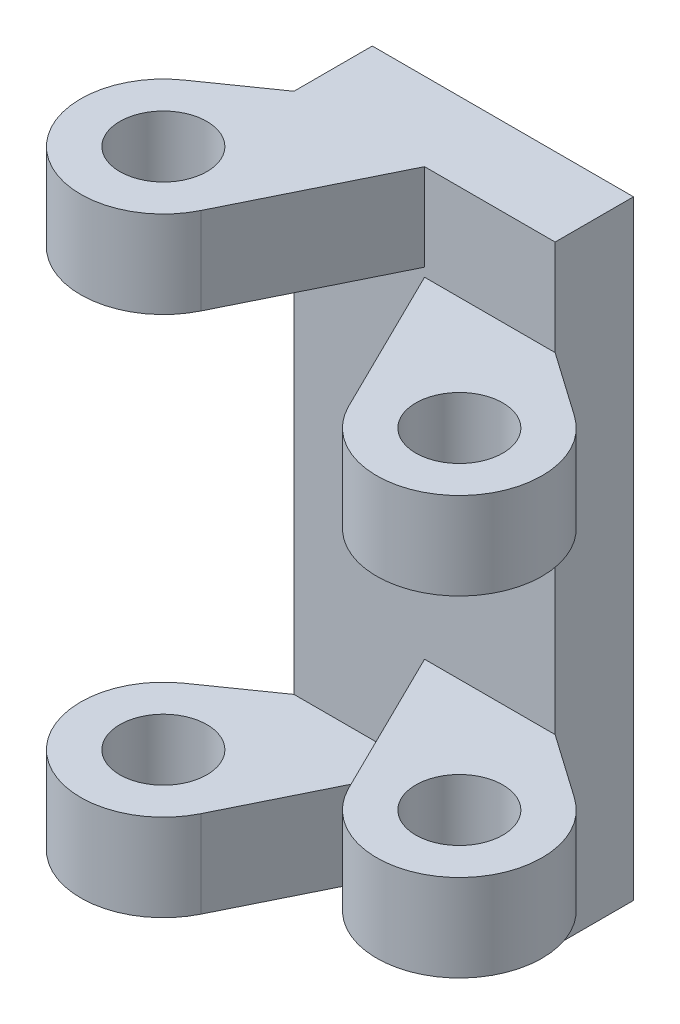
ISO-10303-21;
HEADER;
FILE_DESCRIPTION(('STEP AP214'),'2;1');
FILE_NAME('part.step','',(''),(''),'','','');
FILE_SCHEMA(('AUTOMOTIVE_DESIGN { 1 0 10303 214 1 1 1 1 }'));
ENDSEC;
DATA;
#1=APPLICATION_CONTEXT('core data for automotive mechanical design processes');
#2=APPLICATION_PROTOCOL_DEFINITION('international standard','automotive_design',2000,#1);
#3=PRODUCT_CONTEXT('',#1,'mechanical');
#4=PRODUCT('Part','Part','',(#3));
#5=PRODUCT_RELATED_PRODUCT_CATEGORY('part','',(#4));
#6=PRODUCT_DEFINITION_FORMATION('','',#4);
#7=PRODUCT_DEFINITION_CONTEXT('part definition',#1,'design');
#8=PRODUCT_DEFINITION('design','',#6,#7);
#9=PRODUCT_DEFINITION_SHAPE('','',#8);
#10=(LENGTH_UNIT() NAMED_UNIT(*) SI_UNIT(.MILLI.,.METRE.));
#11=(NAMED_UNIT(*) PLANE_ANGLE_UNIT() SI_UNIT($,.RADIAN.));
#12=(NAMED_UNIT(*) SI_UNIT($,.STERADIAN.) SOLID_ANGLE_UNIT());
#13=UNCERTAINTY_MEASURE_WITH_UNIT(LENGTH_MEASURE(1.E-05),#10,'distance_accuracy_value','');
#14=(GEOMETRIC_REPRESENTATION_CONTEXT(3) GLOBAL_UNCERTAINTY_ASSIGNED_CONTEXT((#13)) GLOBAL_UNIT_ASSIGNED_CONTEXT((#10,
#11,#12)) REPRESENTATION_CONTEXT('',''));
#15=CARTESIAN_POINT('',(0.,0.,0.));
#16=DIRECTION('',(0.,0.,1.));
#17=DIRECTION('',(1.,0.,0.));
#18=AXIS2_PLACEMENT_3D('',#15,#16,#17);
#19=CARTESIAN_POINT('',(1.12922337976629,-7.,-1.61201011884645));
#20=DIRECTION('',(0.573740665267581,0.,-0.819037025425782));
#21=DIRECTION('',(-0.819037025425782,0.,-0.573740665267581));
#22=AXIS2_PLACEMENT_3D('',#19,#20,#21);
#23=PLANE('',#22);
#24=DIRECTION('',(0.,1.,0.));
#25=VECTOR('',#24,1.);
#26=CARTESIAN_POINT('',(7.4901072640084,-7.,2.84382965169101));
#27=LINE('',#26,#25);
#28=CARTESIAN_POINT('',(7.4901072640084,-4.8,2.84382965169101));
#29=VERTEX_POINT('',#28);
#30=CARTESIAN_POINT('',(7.4901072640084,-2.8,2.84382965169101));
#31=VERTEX_POINT('',#30);
#32=EDGE_CURVE('E198',#29,#31,#27,.T.);
#33=ORIENTED_EDGE('',*,*,#32,.F.);
#34=DIRECTION('',(-0.819037025425782,0.,-0.573740665267581));
#35=VECTOR('',#34,1.);
#36=CARTESIAN_POINT('',(7.4901072640084,-4.8,2.84382965169101));
#37=LINE('',#36,#35);
#38=CARTESIAN_POINT('',(6.,-4.8,1.8));
#39=VERTEX_POINT('',#38);
#40=EDGE_CURVE('E174',#29,#39,#37,.T.);
#41=ORIENTED_EDGE('',*,*,#40,.T.);
#42=DIRECTION('',(0.,1.,0.));
#43=VECTOR('',#42,1.);
#44=CARTESIAN_POINT('',(6.,-7.,1.8));
#45=LINE('',#44,#43);
#46=CARTESIAN_POINT('',(6.,-2.8,1.8));
#47=VERTEX_POINT('',#46);
#48=EDGE_CURVE('E45',#39,#47,#45,.T.);
#49=ORIENTED_EDGE('',*,*,#48,.T.);
#50=DIRECTION('',(-0.819037025425782,0.,-0.573740665267581));
#51=VECTOR('',#50,1.);
#52=CARTESIAN_POINT('',(7.4901072640084,-2.8,2.84382965169101));
#53=LINE('',#52,#51);
#54=EDGE_CURVE('E369',#31,#47,#53,.T.);
#55=ORIENTED_EDGE('',*,*,#54,.F.);
#56=EDGE_LOOP('',(#33,#41,#49,#55));
#57=FACE_BOUND('',#56,.T.);
#58=ADVANCED_FACE('F36',(#57),#23,.T.);
#59=CARTESIAN_POINT('',(6.4,-7.,4.4));
#60=DIRECTION('',(0.,1.,0.));
#61=DIRECTION('',(0.,0.,1.));
#62=AXIS2_PLACEMENT_3D('',#59,#60,#61);
#63=CYLINDRICAL_SURFACE('',#62,1.9);
#64=DIRECTION('',(0.,1.,0.));
#65=VECTOR('',#64,1.);
#66=CARTESIAN_POINT('',(4.69581401725786,-7.,5.24008936204741));
#67=LINE('',#66,#65);
#68=CARTESIAN_POINT('',(4.69581401725786,-4.8,5.24008936204741));
#69=VERTEX_POINT('',#68);
#70=CARTESIAN_POINT('',(4.69581401725786,-2.8,5.24008936204741));
#71=VERTEX_POINT('',#70);
#72=EDGE_CURVE('E184',#69,#71,#67,.T.);
#73=ORIENTED_EDGE('',*,*,#72,.F.);
#74=CARTESIAN_POINT('',(6.4,-4.8,4.4));
#75=DIRECTION('',(0.,1.,0.));
#76=DIRECTION('',(0.,0.,1.));
#77=AXIS2_PLACEMENT_3D('',#74,#75,#76);
#78=CIRCLE('',#77,1.9);
#79=EDGE_CURVE('E170',#69,#29,#78,.T.);
#80=ORIENTED_EDGE('',*,*,#79,.T.);
#81=ORIENTED_EDGE('',*,*,#32,.T.);
#82=CARTESIAN_POINT('',(6.4,-2.8,4.4));
#83=DIRECTION('',(0.,1.,0.));
#84=DIRECTION('',(0.,0.,1.));
#85=AXIS2_PLACEMENT_3D('',#82,#83,#84);
#86=CIRCLE('',#85,1.9);
#87=EDGE_CURVE('E193',#71,#31,#86,.T.);
#88=ORIENTED_EDGE('',*,*,#87,.F.);
#89=EDGE_LOOP('',(#73,#80,#81,#88));
#90=FACE_BOUND('',#89,.T.);
#91=ADVANCED_FACE('F191',(#90),#63,.T.);
#92=CARTESIAN_POINT('',(1.69965270477307,-7.,-0.837854653725909));
#93=DIRECTION('',(0.896939990916913,0.,-0.442152295814425));
#94=DIRECTION('',(-0.442152295814425,0.,-0.896939990916914));
#95=AXIS2_PLACEMENT_3D('',#92,#93,#94);
#96=PLANE('',#95);
#97=DIRECTION('',(0.442152295814425,0.,0.896939990916913));
#98=VECTOR('',#97,1.);
#99=CARTESIAN_POINT('',(4.69581401725786,-4.8,5.24008936204741));
#100=LINE('',#99,#98);
#101=CARTESIAN_POINT('',(3.,-4.8,1.8));
#102=VERTEX_POINT('',#101);
#103=EDGE_CURVE('E54',#102,#69,#100,.T.);
#104=ORIENTED_EDGE('',*,*,#103,.T.);
#105=ORIENTED_EDGE('',*,*,#72,.T.);
#106=DIRECTION('',(0.442152295814425,0.,0.896939990916913));
#107=VECTOR('',#106,1.);
#108=CARTESIAN_POINT('',(4.69581401725786,-2.8,5.24008936204741));
#109=LINE('',#108,#107);
#110=CARTESIAN_POINT('',(3.,-2.8,1.8));
#111=VERTEX_POINT('',#110);
#112=EDGE_CURVE('E370',#111,#71,#109,.T.);
#113=ORIENTED_EDGE('',*,*,#112,.F.);
#114=DIRECTION('',(0.,-1.,0.));
#115=VECTOR('',#114,1.);
#116=CARTESIAN_POINT('',(3.,5.,1.8));
#117=LINE('',#116,#115);
#118=EDGE_CURVE('E187',#111,#102,#117,.T.);
#119=ORIENTED_EDGE('',*,*,#118,.T.);
#120=EDGE_LOOP('',(#104,#105,#113,#119));
#121=FACE_BOUND('',#120,.T.);
#122=ADVANCED_FACE('F182',(#121),#96,.F.);
#123=CARTESIAN_POINT('',(6.4,-7.,4.4));
#124=DIRECTION('',(0.,1.,0.));
#125=DIRECTION('',(0.,0.,1.));
#126=AXIS2_PLACEMENT_3D('',#123,#124,#125);
#127=CYLINDRICAL_SURFACE('',#126,1.);
#128=CARTESIAN_POINT('',(6.4,-2.8,4.4));
#129=DIRECTION('',(0.,1.,0.));
#130=DIRECTION('',(0.,0.,1.));
#131=AXIS2_PLACEMENT_3D('',#128,#129,#130);
#132=CIRCLE('',#131,1.);
#133=CARTESIAN_POINT('',(6.4,-2.8,5.4));
#134=VERTEX_POINT('',#133);
#135=EDGE_CURVE('E229',#134,#134,#132,.F.);
#136=ORIENTED_EDGE('',*,*,#135,.F.);
#137=EDGE_LOOP('',(#136));
#138=FACE_BOUND('',#137,.T.);
#139=CARTESIAN_POINT('',(6.4,-4.8,4.4));
#140=DIRECTION('',(0.,-1.,0.));
#141=DIRECTION('',(0.,0.,-1.));
#142=AXIS2_PLACEMENT_3D('',#139,#140,#141);
#143=CIRCLE('',#142,1.);
#144=CARTESIAN_POINT('',(6.4,-4.8,3.4));
#145=VERTEX_POINT('',#144);
#146=EDGE_CURVE('E395',#145,#145,#143,.F.);
#147=ORIENTED_EDGE('',*,*,#146,.F.);
#148=EDGE_LOOP('',(#147));
#149=FACE_BOUND('',#148,.T.);
#150=ADVANCED_FACE('F355',(#138,#149),#127,.F.);
#151=CARTESIAN_POINT('',(0.,-7.,0.));
#152=DIRECTION('',(0.,1.,0.));
#153=DIRECTION('',(0.,0.,1.));
#154=AXIS2_PLACEMENT_3D('',#151,#152,#153);
#155=PLANE('',#154);
#156=CARTESIAN_POINT('',(-0.4,-7.,4.4));
#157=DIRECTION('',(0.,1.,0.));
#158=DIRECTION('',(0.,0.,1.));
#159=AXIS2_PLACEMENT_3D('',#156,#157,#158);
#160=CIRCLE('',#159,1.);
#161=CARTESIAN_POINT('',(-0.4,-7.,5.4));
#162=VERTEX_POINT('',#161);
#163=EDGE_CURVE('E222',#162,#162,#160,.T.);
#164=ORIENTED_EDGE('',*,*,#163,.T.);
#165=EDGE_LOOP('',(#164));
#166=FACE_BOUND('',#165,.T.);
#167=DIRECTION('',(-1.,0.,0.));
#168=VECTOR('',#167,1.);
#169=CARTESIAN_POINT('',(3.,-7.,1.8));
#170=LINE('',#169,#168);
#171=CARTESIAN_POINT('',(6.,-7.,1.8));
#172=VERTEX_POINT('',#171);
#173=CARTESIAN_POINT('',(3.,-7.,1.8));
#174=VERTEX_POINT('',#173);
#175=EDGE_CURVE('E178',#172,#174,#170,.T.);
#176=ORIENTED_EDGE('',*,*,#175,.T.);
#177=DIRECTION('',(0.442152295814425,0.,-0.896939990916914));
#178=VECTOR('',#177,1.);
#179=CARTESIAN_POINT('',(3.12735537906313,-7.,1.54164980342419));
#180=LINE('',#179,#178);
#181=CARTESIAN_POINT('',(1.30418598274214,-7.,5.24008936204741));
#182=VERTEX_POINT('',#181);
#183=EDGE_CURVE('E304',#182,#174,#180,.T.);
#184=ORIENTED_EDGE('',*,*,#183,.F.);
#185=CARTESIAN_POINT('',(-0.4,-7.,4.4));
#186=DIRECTION('',(0.,1.,0.));
#187=DIRECTION('',(0.,0.,1.));
#188=AXIS2_PLACEMENT_3D('',#185,#186,#187);
#189=CIRCLE('',#188,1.9);
#190=CARTESIAN_POINT('',(-1.4901072640084,-7.,2.84382965169101));
#191=VERTEX_POINT('',#190);
#192=EDGE_CURVE('E301',#191,#182,#189,.T.);
#193=ORIENTED_EDGE('',*,*,#192,.F.);
#194=DIRECTION('',(-0.819037025425782,0.,0.573740665267581));
#195=VECTOR('',#194,1.);
#196=CARTESIAN_POINT('',(0.845846726123825,-7.,1.20747896823296));
#197=LINE('',#196,#195);
#198=CARTESIAN_POINT('',(0.,-7.,1.8));
#199=VERTEX_POINT('',#198);
#200=EDGE_CURVE('E298',#199,#191,#197,.T.);
#201=ORIENTED_EDGE('',*,*,#200,.F.);
#202=DIRECTION('',(0.,0.,1.));
#203=VECTOR('',#202,1.);
#204=CARTESIAN_POINT('',(0.,-7.,0.));
#205=LINE('',#204,#203);
#206=CARTESIAN_POINT('',(0.,-7.,0.));
#207=VERTEX_POINT('',#206);
#208=EDGE_CURVE('E295',#207,#199,#205,.T.);
#209=ORIENTED_EDGE('',*,*,#208,.F.);
#210=DIRECTION('',(1.,0.,0.));
#211=VECTOR('',#210,1.);
#212=CARTESIAN_POINT('',(0.,-7.,0.));
#213=LINE('',#212,#211);
#214=CARTESIAN_POINT('',(6.,-7.,0.));
#215=VERTEX_POINT('',#214);
#216=EDGE_CURVE('E293',#207,#215,#213,.T.);
#217=ORIENTED_EDGE('',*,*,#216,.T.);
#218=DIRECTION('',(0.,0.,1.));
#219=VECTOR('',#218,1.);
#220=CARTESIAN_POINT('',(6.,-7.,0.));
#221=LINE('',#220,#219);
#222=EDGE_CURVE('E290',#215,#172,#221,.T.);
#223=ORIENTED_EDGE('',*,*,#222,.T.);
#224=EDGE_LOOP('',(#176,#184,#193,#201,#209,#217,#223));
#225=FACE_BOUND('',#224,.T.);
#226=ADVANCED_FACE('F310',(#166,#225),#155,.F.);
#227=CARTESIAN_POINT('',(6.,2.8,1.8));
#228=VERTEX_POINT('',#227);
#229=CARTESIAN_POINT('',(6.,4.8,1.8));
#230=VERTEX_POINT('',#229);
#231=EDGE_CURVE('E47',#228,#230,#45,.T.);
#232=ORIENTED_EDGE('',*,*,#231,.T.);
#233=DIRECTION('',(-0.819037025425782,0.,-0.573740665267581));
#234=VECTOR('',#233,1.);
#235=CARTESIAN_POINT('',(7.4901072640084,4.8,2.84382965169101));
#236=LINE('',#235,#234);
#237=CARTESIAN_POINT('',(7.4901072640084,4.8,2.84382965169101));
#238=VERTEX_POINT('',#237);
#239=EDGE_CURVE('E362',#238,#230,#236,.T.);
#240=ORIENTED_EDGE('',*,*,#239,.F.);
#241=CARTESIAN_POINT('',(7.4901072640084,2.8,2.84382965169101));
#242=VERTEX_POINT('',#241);
#243=EDGE_CURVE('E194',#242,#238,#27,.T.);
#244=ORIENTED_EDGE('',*,*,#243,.F.);
#245=DIRECTION('',(-0.819037025425782,0.,-0.573740665267581));
#246=VECTOR('',#245,1.);
#247=CARTESIAN_POINT('',(7.4901072640084,2.8,2.84382965169101));
#248=LINE('',#247,#246);
#249=EDGE_CURVE('E363',#242,#228,#248,.T.);
#250=ORIENTED_EDGE('',*,*,#249,.T.);
#251=EDGE_LOOP('',(#232,#240,#244,#250));
#252=FACE_BOUND('',#251,.T.);
#253=ADVANCED_FACE('F341',(#252),#23,.T.);
#254=ORIENTED_EDGE('',*,*,#243,.T.);
#255=CARTESIAN_POINT('',(6.4,4.8,4.4));
#256=DIRECTION('',(0.,1.,0.));
#257=DIRECTION('',(0.,0.,1.));
#258=AXIS2_PLACEMENT_3D('',#255,#256,#257);
#259=CIRCLE('',#258,1.9);
#260=CARTESIAN_POINT('',(4.69581401725786,4.8,5.24008936204741));
#261=VERTEX_POINT('',#260);
#262=EDGE_CURVE('E389',#261,#238,#259,.T.);
#263=ORIENTED_EDGE('',*,*,#262,.F.);
#264=CARTESIAN_POINT('',(4.69581401725786,2.8,5.24008936204741));
#265=VERTEX_POINT('',#264);
#266=EDGE_CURVE('E195',#265,#261,#67,.T.);
#267=ORIENTED_EDGE('',*,*,#266,.F.);
#268=CARTESIAN_POINT('',(6.4,2.8,4.4));
#269=DIRECTION('',(0.,1.,0.));
#270=DIRECTION('',(0.,0.,1.));
#271=AXIS2_PLACEMENT_3D('',#268,#269,#270);
#272=CIRCLE('',#271,1.9);
#273=EDGE_CURVE('E380',#265,#242,#272,.T.);
#274=ORIENTED_EDGE('',*,*,#273,.T.);
#275=EDGE_LOOP('',(#254,#263,#267,#274));
#276=FACE_BOUND('',#275,.T.);
#277=ADVANCED_FACE('F346',(#276),#63,.T.);
#278=DIRECTION('',(0.442152295814425,0.,0.896939990916913));
#279=VECTOR('',#278,1.);
#280=CARTESIAN_POINT('',(4.69581401725786,4.8,5.24008936204741));
#281=LINE('',#280,#279);
#282=CARTESIAN_POINT('',(3.,4.8,1.8));
#283=VERTEX_POINT('',#282);
#284=EDGE_CURVE('E401',#283,#261,#281,.T.);
#285=ORIENTED_EDGE('',*,*,#284,.F.);
#286=CARTESIAN_POINT('',(3.,2.8,1.8));
#287=VERTEX_POINT('',#286);
#288=EDGE_CURVE('E62',#283,#287,#117,.T.);
#289=ORIENTED_EDGE('',*,*,#288,.T.);
#290=DIRECTION('',(0.442152295814425,0.,0.896939990916913));
#291=VECTOR('',#290,1.);
#292=CARTESIAN_POINT('',(4.69581401725786,2.8,5.24008936204741));
#293=LINE('',#292,#291);
#294=EDGE_CURVE('E237',#287,#265,#293,.T.);
#295=ORIENTED_EDGE('',*,*,#294,.T.);
#296=ORIENTED_EDGE('',*,*,#266,.T.);
#297=EDGE_LOOP('',(#285,#289,#295,#296));
#298=FACE_BOUND('',#297,.T.);
#299=ADVANCED_FACE('F353',(#298),#96,.F.);
#300=CARTESIAN_POINT('',(6.4,2.8,4.4));
#301=DIRECTION('',(0.,1.,0.));
#302=DIRECTION('',(0.,0.,1.));
#303=AXIS2_PLACEMENT_3D('',#300,#301,#302);
#304=CIRCLE('',#303,1.);
#305=CARTESIAN_POINT('',(6.4,2.8,5.4));
#306=VERTEX_POINT('',#305);
#307=EDGE_CURVE('E40',#306,#306,#304,.F.);
#308=ORIENTED_EDGE('',*,*,#307,.T.);
#309=EDGE_LOOP('',(#308));
#310=FACE_BOUND('',#309,.T.);
#311=CARTESIAN_POINT('',(6.4,4.8,4.4));
#312=DIRECTION('',(0.,1.,0.));
#313=DIRECTION('',(0.,0.,1.));
#314=AXIS2_PLACEMENT_3D('',#311,#312,#313);
#315=CIRCLE('',#314,1.);
#316=CARTESIAN_POINT('',(6.4,4.8,5.4));
#317=VERTEX_POINT('',#316);
#318=EDGE_CURVE('E371',#317,#317,#315,.F.);
#319=ORIENTED_EDGE('',*,*,#318,.F.);
#320=EDGE_LOOP('',(#319));
#321=FACE_BOUND('',#320,.T.);
#322=ADVANCED_FACE('F409',(#310,#321),#127,.F.);
#323=CARTESIAN_POINT('',(3.12735537906313,-7.,1.54164980342419));
#324=DIRECTION('',(0.896939990916913,0.,0.442152295814425));
#325=DIRECTION('',(0.442152295814425,0.,-0.896939990916914));
#326=AXIS2_PLACEMENT_3D('',#323,#324,#325);
#327=PLANE('',#326);
#328=DIRECTION('',(0.,1.,0.));
#329=VECTOR('',#328,1.);
#330=CARTESIAN_POINT('',(3.,-7.,1.8));
#331=LINE('',#330,#329);
#332=CARTESIAN_POINT('',(3.,-5.,1.8));
#333=VERTEX_POINT('',#332);
#334=EDGE_CURVE('E201',#174,#333,#331,.T.);
#335=ORIENTED_EDGE('',*,*,#334,.T.);
#336=DIRECTION('',(0.442152295814425,0.,-0.896939990916913));
#337=VECTOR('',#336,1.);
#338=CARTESIAN_POINT('',(1.30418598274214,-5.,5.24008936204741));
#339=LINE('',#338,#337);
#340=CARTESIAN_POINT('',(1.30418598274214,-5.,5.24008936204741));
#341=VERTEX_POINT('',#340);
#342=EDGE_CURVE('E247',#341,#333,#339,.T.);
#343=ORIENTED_EDGE('',*,*,#342,.F.);
#344=DIRECTION('',(0.,1.,0.));
#345=VECTOR('',#344,1.);
#346=CARTESIAN_POINT('',(1.30418598274214,-7.,5.24008936204741));
#347=LINE('',#346,#345);
#348=EDGE_CURVE('E206',#182,#341,#347,.T.);
#349=ORIENTED_EDGE('',*,*,#348,.F.);
#350=ORIENTED_EDGE('',*,*,#183,.T.);
#351=EDGE_LOOP('',(#335,#343,#349,#350));
#352=FACE_BOUND('',#351,.T.);
#353=ADVANCED_FACE('F411',(#352),#327,.T.);
#354=CARTESIAN_POINT('',(-0.4,-7.,4.4));
#355=DIRECTION('',(0.,1.,0.));
#356=DIRECTION('',(0.,0.,1.));
#357=AXIS2_PLACEMENT_3D('',#354,#355,#356);
#358=CYLINDRICAL_SURFACE('',#357,1.9);
#359=ORIENTED_EDGE('',*,*,#348,.T.);
#360=CARTESIAN_POINT('',(-0.4,-5.,4.4));
#361=DIRECTION('',(0.,1.,0.));
#362=DIRECTION('',(0.,0.,1.));
#363=AXIS2_PLACEMENT_3D('',#360,#361,#362);
#364=CIRCLE('',#363,1.9);
#365=CARTESIAN_POINT('',(-1.4901072640084,-5.,2.84382965169101));
#366=VERTEX_POINT('',#365);
#367=EDGE_CURVE('E235',#366,#341,#364,.T.);
#368=ORIENTED_EDGE('',*,*,#367,.F.);
#369=DIRECTION('',(0.,1.,0.));
#370=VECTOR('',#369,1.);
#371=CARTESIAN_POINT('',(-1.4901072640084,-7.,2.84382965169101));
#372=LINE('',#371,#370);
#373=EDGE_CURVE('E210',#191,#366,#372,.T.);
#374=ORIENTED_EDGE('',*,*,#373,.F.);
#375=ORIENTED_EDGE('',*,*,#192,.T.);
#376=EDGE_LOOP('',(#359,#368,#374,#375));
#377=FACE_BOUND('',#376,.T.);
#378=ADVANCED_FACE('F418',(#377),#358,.T.);
#379=CARTESIAN_POINT('',(0.845846726123825,-7.,1.20747896823296));
#380=DIRECTION('',(-0.573740665267581,0.,-0.819037025425782));
#381=DIRECTION('',(-0.819037025425782,0.,0.573740665267581));
#382=AXIS2_PLACEMENT_3D('',#379,#380,#381);
#383=PLANE('',#382);
#384=ORIENTED_EDGE('',*,*,#373,.T.);
#385=DIRECTION('',(-0.819037025425782,0.,0.573740665267581));
#386=VECTOR('',#385,1.);
#387=CARTESIAN_POINT('',(0.,-5.,1.8));
#388=LINE('',#387,#386);
#389=CARTESIAN_POINT('',(0.,-5.,1.8));
#390=VERTEX_POINT('',#389);
#391=EDGE_CURVE('E253',#390,#366,#388,.T.);
#392=ORIENTED_EDGE('',*,*,#391,.F.);
#393=DIRECTION('',(0.,1.,0.));
#394=VECTOR('',#393,1.);
#395=CARTESIAN_POINT('',(0.,-7.,1.8));
#396=LINE('',#395,#394);
#397=EDGE_CURVE('E214',#199,#390,#396,.T.);
#398=ORIENTED_EDGE('',*,*,#397,.F.);
#399=ORIENTED_EDGE('',*,*,#200,.T.);
#400=EDGE_LOOP('',(#384,#392,#398,#399));
#401=FACE_BOUND('',#400,.T.);
#402=ADVANCED_FACE('F316',(#401),#383,.T.);
#403=CARTESIAN_POINT('',(-0.4,-7.,4.4));
#404=DIRECTION('',(0.,1.,0.));
#405=DIRECTION('',(0.,0.,1.));
#406=AXIS2_PLACEMENT_3D('',#403,#404,#405);
#407=CYLINDRICAL_SURFACE('',#406,1.);
#408=ORIENTED_EDGE('',*,*,#163,.F.);
#409=EDGE_LOOP('',(#408));
#410=FACE_BOUND('',#409,.T.);
#411=CARTESIAN_POINT('',(-0.4,-5.,4.4));
#412=DIRECTION('',(0.,1.,0.));
#413=DIRECTION('',(0.,0.,1.));
#414=AXIS2_PLACEMENT_3D('',#411,#412,#413);
#415=CIRCLE('',#414,1.);
#416=CARTESIAN_POINT('',(-0.4,-5.,5.4));
#417=VERTEX_POINT('',#416);
#418=EDGE_CURVE('E223',#417,#417,#415,.F.);
#419=ORIENTED_EDGE('',*,*,#418,.F.);
#420=EDGE_LOOP('',(#419));
#421=FACE_BOUND('',#420,.T.);
#422=ADVANCED_FACE('F313',(#410,#421),#407,.F.);
#423=CARTESIAN_POINT('',(6.,-7.,0.));
#424=DIRECTION('',(-1.,0.,0.));
#425=DIRECTION('',(0.,0.,1.));
#426=AXIS2_PLACEMENT_3D('',#423,#424,#425);
#427=PLANE('',#426);
#428=DIRECTION('',(0.,1.,0.));
#429=VECTOR('',#428,1.);
#430=CARTESIAN_POINT('',(6.,-7.,0.));
#431=LINE('',#430,#429);
#432=CARTESIAN_POINT('',(6.,7.,0.));
#433=VERTEX_POINT('',#432);
#434=EDGE_CURVE('E220',#215,#433,#431,.T.);
#435=ORIENTED_EDGE('',*,*,#434,.T.);
#436=DIRECTION('',(0.,0.,1.));
#437=VECTOR('',#436,1.);
#438=CARTESIAN_POINT('',(6.,7.,0.));
#439=LINE('',#438,#437);
#440=CARTESIAN_POINT('',(6.,7.,1.8));
#441=VERTEX_POINT('',#440);
#442=EDGE_CURVE('E228',#433,#441,#439,.T.);
#443=ORIENTED_EDGE('',*,*,#442,.T.);
#444=DIRECTION('',(0.,1.,0.));
#445=VECTOR('',#444,1.);
#446=CARTESIAN_POINT('',(6.,4.8,1.8));
#447=LINE('',#446,#445);
#448=EDGE_CURVE('E402',#230,#441,#447,.T.);
#449=ORIENTED_EDGE('',*,*,#448,.F.);
#450=ORIENTED_EDGE('',*,*,#231,.F.);
#451=DIRECTION('',(0.,-1.,0.));
#452=VECTOR('',#451,1.);
#453=CARTESIAN_POINT('',(6.,2.8,1.8));
#454=LINE('',#453,#452);
#455=EDGE_CURVE('E231',#228,#47,#454,.T.);
#456=ORIENTED_EDGE('',*,*,#455,.T.);
#457=ORIENTED_EDGE('',*,*,#48,.F.);
#458=EDGE_CURVE('E11',#172,#39,#45,.T.);
#459=ORIENTED_EDGE('',*,*,#458,.F.);
#460=ORIENTED_EDGE('',*,*,#222,.F.);
#461=EDGE_LOOP('',(#435,#443,#449,#450,#456,#457,#459,#460));
#462=FACE_BOUND('',#461,.T.);
#463=ADVANCED_FACE('F38',(#462),#427,.F.);
#464=DIRECTION('',(0.442152295814425,0.,-0.896939990916913));
#465=VECTOR('',#464,1.);
#466=CARTESIAN_POINT('',(1.30418598274214,5.,5.24008936204741));
#467=LINE('',#466,#465);
#468=CARTESIAN_POINT('',(1.30418598274214,5.,5.24008936204741));
#469=VERTEX_POINT('',#468);
#470=CARTESIAN_POINT('',(3.,5.,1.8));
#471=VERTEX_POINT('',#470);
#472=EDGE_CURVE('E258',#469,#471,#467,.T.);
#473=ORIENTED_EDGE('',*,*,#472,.T.);
#474=CARTESIAN_POINT('',(3.,7.,1.8));
#475=VERTEX_POINT('',#474);
#476=EDGE_CURVE('E205',#471,#475,#331,.T.);
#477=ORIENTED_EDGE('',*,*,#476,.T.);
#478=DIRECTION('',(0.442152295814425,0.,-0.896939990916914));
#479=VECTOR('',#478,1.);
#480=CARTESIAN_POINT('',(3.12735537906313,7.,1.54164980342419));
#481=LINE('',#480,#479);
#482=CARTESIAN_POINT('',(1.30418598274214,7.,5.24008936204741));
#483=VERTEX_POINT('',#482);
#484=EDGE_CURVE('E284',#483,#475,#481,.T.);
#485=ORIENTED_EDGE('',*,*,#484,.F.);
#486=EDGE_CURVE('E209',#469,#483,#347,.T.);
#487=ORIENTED_EDGE('',*,*,#486,.F.);
#488=EDGE_LOOP('',(#473,#477,#485,#487));
#489=FACE_BOUND('',#488,.T.);
#490=ADVANCED_FACE('F421',(#489),#327,.T.);
#491=CARTESIAN_POINT('',(-0.4,5.,4.4));
#492=DIRECTION('',(0.,1.,0.));
#493=DIRECTION('',(0.,0.,1.));
#494=AXIS2_PLACEMENT_3D('',#491,#492,#493);
#495=CIRCLE('',#494,1.9);
#496=CARTESIAN_POINT('',(-1.4901072640084,5.,2.84382965169101));
#497=VERTEX_POINT('',#496);
#498=EDGE_CURVE('E255',#497,#469,#495,.T.);
#499=ORIENTED_EDGE('',*,*,#498,.T.);
#500=ORIENTED_EDGE('',*,*,#486,.T.);
#501=CARTESIAN_POINT('',(-0.4,7.,4.4));
#502=DIRECTION('',(0.,1.,0.));
#503=DIRECTION('',(0.,0.,1.));
#504=AXIS2_PLACEMENT_3D('',#501,#502,#503);
#505=CIRCLE('',#504,1.9);
#506=CARTESIAN_POINT('',(-1.4901072640084,7.,2.84382965169101));
#507=VERTEX_POINT('',#506);
#508=EDGE_CURVE('E281',#507,#483,#505,.T.);
#509=ORIENTED_EDGE('',*,*,#508,.F.);
#510=EDGE_CURVE('E213',#497,#507,#372,.T.);
#511=ORIENTED_EDGE('',*,*,#510,.F.);
#512=EDGE_LOOP('',(#499,#500,#509,#511));
#513=FACE_BOUND('',#512,.T.);
#514=ADVANCED_FACE('F459',(#513),#358,.T.);
#515=DIRECTION('',(-0.819037025425782,0.,0.573740665267581));
#516=VECTOR('',#515,1.);
#517=CARTESIAN_POINT('',(0.,5.,1.8));
#518=LINE('',#517,#516);
#519=CARTESIAN_POINT('',(0.,5.,1.8));
#520=VERTEX_POINT('',#519);
#521=EDGE_CURVE('E264',#520,#497,#518,.T.);
#522=ORIENTED_EDGE('',*,*,#521,.T.);
#523=ORIENTED_EDGE('',*,*,#510,.T.);
#524=DIRECTION('',(-0.819037025425782,0.,0.573740665267581));
#525=VECTOR('',#524,1.);
#526=CARTESIAN_POINT('',(0.845846726123825,7.,1.20747896823296));
#527=LINE('',#526,#525);
#528=CARTESIAN_POINT('',(0.,7.,1.8));
#529=VERTEX_POINT('',#528);
#530=EDGE_CURVE('E278',#529,#507,#527,.T.);
#531=ORIENTED_EDGE('',*,*,#530,.F.);
#532=EDGE_CURVE('E217',#520,#529,#396,.T.);
#533=ORIENTED_EDGE('',*,*,#532,.F.);
#534=EDGE_LOOP('',(#522,#523,#531,#533));
#535=FACE_BOUND('',#534,.T.);
#536=ADVANCED_FACE('F464',(#535),#383,.T.);
#537=CARTESIAN_POINT('',(0.,-7.,0.));
#538=DIRECTION('',(-1.,0.,0.));
#539=DIRECTION('',(0.,0.,1.));
#540=AXIS2_PLACEMENT_3D('',#537,#538,#539);
#541=PLANE('',#540);
#542=ORIENTED_EDGE('',*,*,#397,.T.);
#543=DIRECTION('',(0.,-1.,0.));
#544=VECTOR('',#543,1.);
#545=CARTESIAN_POINT('',(0.,5.,1.8));
#546=LINE('',#545,#544);
#547=EDGE_CURVE('E267',#520,#390,#546,.T.);
#548=ORIENTED_EDGE('',*,*,#547,.F.);
#549=ORIENTED_EDGE('',*,*,#532,.T.);
#550=DIRECTION('',(0.,0.,1.));
#551=VECTOR('',#550,1.);
#552=CARTESIAN_POINT('',(0.,7.,0.));
#553=LINE('',#552,#551);
#554=CARTESIAN_POINT('',(0.,7.,0.));
#555=VERTEX_POINT('',#554);
#556=EDGE_CURVE('E275',#555,#529,#553,.T.);
#557=ORIENTED_EDGE('',*,*,#556,.F.);
#558=DIRECTION('',(0.,1.,0.));
#559=VECTOR('',#558,1.);
#560=CARTESIAN_POINT('',(0.,-7.,0.));
#561=LINE('',#560,#559);
#562=EDGE_CURVE('E218',#207,#555,#561,.T.);
#563=ORIENTED_EDGE('',*,*,#562,.F.);
#564=ORIENTED_EDGE('',*,*,#208,.T.);
#565=EDGE_LOOP('',(#542,#548,#549,#557,#563,#564));
#566=FACE_BOUND('',#565,.T.);
#567=ADVANCED_FACE('F447',(#566),#541,.T.);
#568=CARTESIAN_POINT('',(-0.4,5.,4.4));
#569=DIRECTION('',(0.,1.,0.));
#570=DIRECTION('',(0.,0.,1.));
#571=AXIS2_PLACEMENT_3D('',#568,#569,#570);
#572=CIRCLE('',#571,1.);
#573=CARTESIAN_POINT('',(-0.4,5.,5.4));
#574=VERTEX_POINT('',#573);
#575=EDGE_CURVE('E226',#574,#574,#572,.F.);
#576=ORIENTED_EDGE('',*,*,#575,.T.);
#577=EDGE_LOOP('',(#576));
#578=FACE_BOUND('',#577,.T.);
#579=CARTESIAN_POINT('',(-0.4,7.,4.4));
#580=DIRECTION('',(0.,1.,0.));
#581=DIRECTION('',(0.,0.,1.));
#582=AXIS2_PLACEMENT_3D('',#579,#580,#581);
#583=CIRCLE('',#582,1.);
#584=CARTESIAN_POINT('',(-0.4,7.,5.4));
#585=VERTEX_POINT('',#584);
#586=EDGE_CURVE('E287',#585,#585,#583,.T.);
#587=ORIENTED_EDGE('',*,*,#586,.T.);
#588=EDGE_LOOP('',(#587));
#589=FACE_BOUND('',#588,.T.);
#590=ADVANCED_FACE('F318',(#578,#589),#407,.F.);
#591=CARTESIAN_POINT('',(0.,-7.,0.));
#592=DIRECTION('',(0.,0.,1.));
#593=DIRECTION('',(1.,0.,0.));
#594=AXIS2_PLACEMENT_3D('',#591,#592,#593);
#595=PLANE('',#594);
#596=ORIENTED_EDGE('',*,*,#562,.T.);
#597=DIRECTION('',(1.,0.,0.));
#598=VECTOR('',#597,1.);
#599=CARTESIAN_POINT('',(0.,7.,0.));
#600=LINE('',#599,#598);
#601=EDGE_CURVE('E272',#555,#433,#600,.T.);
#602=ORIENTED_EDGE('',*,*,#601,.T.);
#603=ORIENTED_EDGE('',*,*,#434,.F.);
#604=ORIENTED_EDGE('',*,*,#216,.F.);
#605=EDGE_LOOP('',(#596,#602,#603,#604));
#606=FACE_BOUND('',#605,.T.);
#607=ADVANCED_FACE('F452',(#606),#595,.F.);
#608=CARTESIAN_POINT('',(0.,7.,0.));
#609=DIRECTION('',(0.,1.,0.));
#610=DIRECTION('',(0.,0.,1.));
#611=AXIS2_PLACEMENT_3D('',#608,#609,#610);
#612=PLANE('',#611);
#613=DIRECTION('',(-1.,0.,0.));
#614=VECTOR('',#613,1.);
#615=CARTESIAN_POINT('',(3.,7.,1.8));
#616=LINE('',#615,#614);
#617=EDGE_CURVE('E391',#441,#475,#616,.T.);
#618=ORIENTED_EDGE('',*,*,#617,.F.);
#619=ORIENTED_EDGE('',*,*,#442,.F.);
#620=ORIENTED_EDGE('',*,*,#601,.F.);
#621=ORIENTED_EDGE('',*,*,#556,.T.);
#622=ORIENTED_EDGE('',*,*,#530,.T.);
#623=ORIENTED_EDGE('',*,*,#508,.T.);
#624=ORIENTED_EDGE('',*,*,#484,.T.);
#625=EDGE_LOOP('',(#618,#619,#620,#621,#622,#623,#624));
#626=FACE_BOUND('',#625,.T.);
#627=ORIENTED_EDGE('',*,*,#586,.F.);
#628=EDGE_LOOP('',(#627));
#629=FACE_BOUND('',#628,.T.);
#630=ADVANCED_FACE('F334',(#626,#629),#612,.T.);
#631=CARTESIAN_POINT('',(-0.4,5.,4.4));
#632=DIRECTION('',(0.,1.,0.));
#633=DIRECTION('',(0.,0.,1.));
#634=AXIS2_PLACEMENT_3D('',#631,#632,#633);
#635=PLANE('',#634);
#636=ORIENTED_EDGE('',*,*,#498,.F.);
#637=ORIENTED_EDGE('',*,*,#521,.F.);
#638=DIRECTION('',(-1.,0.,0.));
#639=VECTOR('',#638,1.);
#640=CARTESIAN_POINT('',(0.,5.,1.8));
#641=LINE('',#640,#639);
#642=EDGE_CURVE('E261',#471,#520,#641,.T.);
#643=ORIENTED_EDGE('',*,*,#642,.F.);
#644=ORIENTED_EDGE('',*,*,#472,.F.);
#645=EDGE_LOOP('',(#636,#637,#643,#644));
#646=FACE_BOUND('',#645,.T.);
#647=ORIENTED_EDGE('',*,*,#575,.F.);
#648=EDGE_LOOP('',(#647));
#649=FACE_BOUND('',#648,.T.);
#650=ADVANCED_FACE('F324',(#646,#649),#635,.F.);
#651=CARTESIAN_POINT('',(-0.4,-5.,4.4));
#652=DIRECTION('',(0.,1.,0.));
#653=DIRECTION('',(0.,0.,1.));
#654=AXIS2_PLACEMENT_3D('',#651,#652,#653);
#655=PLANE('',#654);
#656=ORIENTED_EDGE('',*,*,#367,.T.);
#657=ORIENTED_EDGE('',*,*,#342,.T.);
#658=DIRECTION('',(-1.,0.,0.));
#659=VECTOR('',#658,1.);
#660=CARTESIAN_POINT('',(0.,-5.,1.8));
#661=LINE('',#660,#659);
#662=EDGE_CURVE('E250',#333,#390,#661,.T.);
#663=ORIENTED_EDGE('',*,*,#662,.T.);
#664=ORIENTED_EDGE('',*,*,#391,.T.);
#665=EDGE_LOOP('',(#656,#657,#663,#664));
#666=FACE_BOUND('',#665,.T.);
#667=ORIENTED_EDGE('',*,*,#418,.T.);
#668=EDGE_LOOP('',(#667));
#669=FACE_BOUND('',#668,.T.);
#670=ADVANCED_FACE('F321',(#666,#669),#655,.T.);
#671=CARTESIAN_POINT('',(0.,5.,1.8));
#672=DIRECTION('',(0.,0.,1.));
#673=DIRECTION('',(1.,0.,0.));
#674=AXIS2_PLACEMENT_3D('',#671,#672,#673);
#675=PLANE('',#674);
#676=ORIENTED_EDGE('',*,*,#288,.F.);
#677=DIRECTION('',(-1.,0.,0.));
#678=VECTOR('',#677,1.);
#679=CARTESIAN_POINT('',(3.,4.8,1.8));
#680=LINE('',#679,#678);
#681=EDGE_CURVE('E393',#230,#283,#680,.T.);
#682=ORIENTED_EDGE('',*,*,#681,.F.);
#683=ORIENTED_EDGE('',*,*,#448,.T.);
#684=ORIENTED_EDGE('',*,*,#617,.T.);
#685=ORIENTED_EDGE('',*,*,#476,.F.);
#686=ORIENTED_EDGE('',*,*,#642,.T.);
#687=ORIENTED_EDGE('',*,*,#547,.T.);
#688=ORIENTED_EDGE('',*,*,#662,.F.);
#689=ORIENTED_EDGE('',*,*,#334,.F.);
#690=ORIENTED_EDGE('',*,*,#175,.F.);
#691=ORIENTED_EDGE('',*,*,#458,.T.);
#692=DIRECTION('',(-1.,0.,0.));
#693=VECTOR('',#692,1.);
#694=CARTESIAN_POINT('',(3.,-4.8,1.8));
#695=LINE('',#694,#693);
#696=EDGE_CURVE('E188',#39,#102,#695,.T.);
#697=ORIENTED_EDGE('',*,*,#696,.T.);
#698=ORIENTED_EDGE('',*,*,#118,.F.);
#699=DIRECTION('',(-1.,0.,0.));
#700=VECTOR('',#699,1.);
#701=CARTESIAN_POINT('',(3.,-2.8,1.8));
#702=LINE('',#701,#700);
#703=EDGE_CURVE('E374',#47,#111,#702,.T.);
#704=ORIENTED_EDGE('',*,*,#703,.F.);
#705=ORIENTED_EDGE('',*,*,#455,.F.);
#706=DIRECTION('',(-1.,0.,0.));
#707=VECTOR('',#706,1.);
#708=CARTESIAN_POINT('',(3.,2.8,1.8));
#709=LINE('',#708,#707);
#710=EDGE_CURVE('E242',#228,#287,#709,.T.);
#711=ORIENTED_EDGE('',*,*,#710,.T.);
#712=EDGE_LOOP('',(#676,#682,#683,#684,#685,#686,#687,#688,#689,#690,#691,#697,#698,#704,#705,#711));
#713=FACE_BOUND('',#712,.T.);
#714=ADVANCED_FACE('F323',(#713),#675,.T.);
#715=CARTESIAN_POINT('',(6.4,2.8,4.4));
#716=DIRECTION('',(0.,1.,0.));
#717=DIRECTION('',(0.,0.,1.));
#718=AXIS2_PLACEMENT_3D('',#715,#716,#717);
#719=PLANE('',#718);
#720=ORIENTED_EDGE('',*,*,#273,.F.);
#721=ORIENTED_EDGE('',*,*,#294,.F.);
#722=ORIENTED_EDGE('',*,*,#710,.F.);
#723=ORIENTED_EDGE('',*,*,#249,.F.);
#724=EDGE_LOOP('',(#720,#721,#722,#723));
#725=FACE_BOUND('',#724,.T.);
#726=ORIENTED_EDGE('',*,*,#307,.F.);
#727=EDGE_LOOP('',(#726));
#728=FACE_BOUND('',#727,.T.);
#729=ADVANCED_FACE('F331',(#725,#728),#719,.F.);
#730=CARTESIAN_POINT('',(6.4,-2.8,4.4));
#731=DIRECTION('',(0.,1.,0.));
#732=DIRECTION('',(0.,0.,1.));
#733=AXIS2_PLACEMENT_3D('',#730,#731,#732);
#734=PLANE('',#733);
#735=ORIENTED_EDGE('',*,*,#87,.T.);
#736=ORIENTED_EDGE('',*,*,#54,.T.);
#737=ORIENTED_EDGE('',*,*,#703,.T.);
#738=ORIENTED_EDGE('',*,*,#112,.T.);
#739=EDGE_LOOP('',(#735,#736,#737,#738));
#740=FACE_BOUND('',#739,.T.);
#741=ORIENTED_EDGE('',*,*,#135,.T.);
#742=EDGE_LOOP('',(#741));
#743=FACE_BOUND('',#742,.T.);
#744=ADVANCED_FACE('F368',(#740,#743),#734,.T.);
#745=CARTESIAN_POINT('',(6.4,4.8,4.4));
#746=DIRECTION('',(0.,1.,0.));
#747=DIRECTION('',(0.,0.,1.));
#748=AXIS2_PLACEMENT_3D('',#745,#746,#747);
#749=PLANE('',#748);
#750=ORIENTED_EDGE('',*,*,#262,.T.);
#751=ORIENTED_EDGE('',*,*,#239,.T.);
#752=ORIENTED_EDGE('',*,*,#681,.T.);
#753=ORIENTED_EDGE('',*,*,#284,.T.);
#754=EDGE_LOOP('',(#750,#751,#752,#753));
#755=FACE_BOUND('',#754,.T.);
#756=ORIENTED_EDGE('',*,*,#318,.T.);
#757=EDGE_LOOP('',(#756));
#758=FACE_BOUND('',#757,.T.);
#759=ADVANCED_FACE('F407',(#755,#758),#749,.T.);
#760=CARTESIAN_POINT('',(6.4,-4.8,4.4));
#761=DIRECTION('',(0.,-1.,0.));
#762=DIRECTION('',(0.,0.,1.));
#763=AXIS2_PLACEMENT_3D('',#760,#761,#762);
#764=PLANE('',#763);
#765=ORIENTED_EDGE('',*,*,#79,.F.);
#766=ORIENTED_EDGE('',*,*,#103,.F.);
#767=ORIENTED_EDGE('',*,*,#696,.F.);
#768=ORIENTED_EDGE('',*,*,#40,.F.);
#769=EDGE_LOOP('',(#765,#766,#767,#768));
#770=FACE_BOUND('',#769,.T.);
#771=ORIENTED_EDGE('',*,*,#146,.T.);
#772=EDGE_LOOP('',(#771));
#773=FACE_BOUND('',#772,.T.);
#774=ADVANCED_FACE('F171',(#770,#773),#764,.T.);
#775=CLOSED_SHELL('',(#58,#91,#122,#150,#226,#253,#277,#299,#322,#353,#378,#402,#422,#463,#490,
#514,#536,#567,#590,#607,#630,#650,#670,#714,#729,#744,#759,#774));
#776=MANIFOLD_SOLID_BREP('B2',#775);
#777=ADVANCED_BREP_SHAPE_REPRESENTATION('',(#18,#776),#14);
#778=SHAPE_DEFINITION_REPRESENTATION(#9,#777);
ENDSEC;
END-ISO-10303-21;
